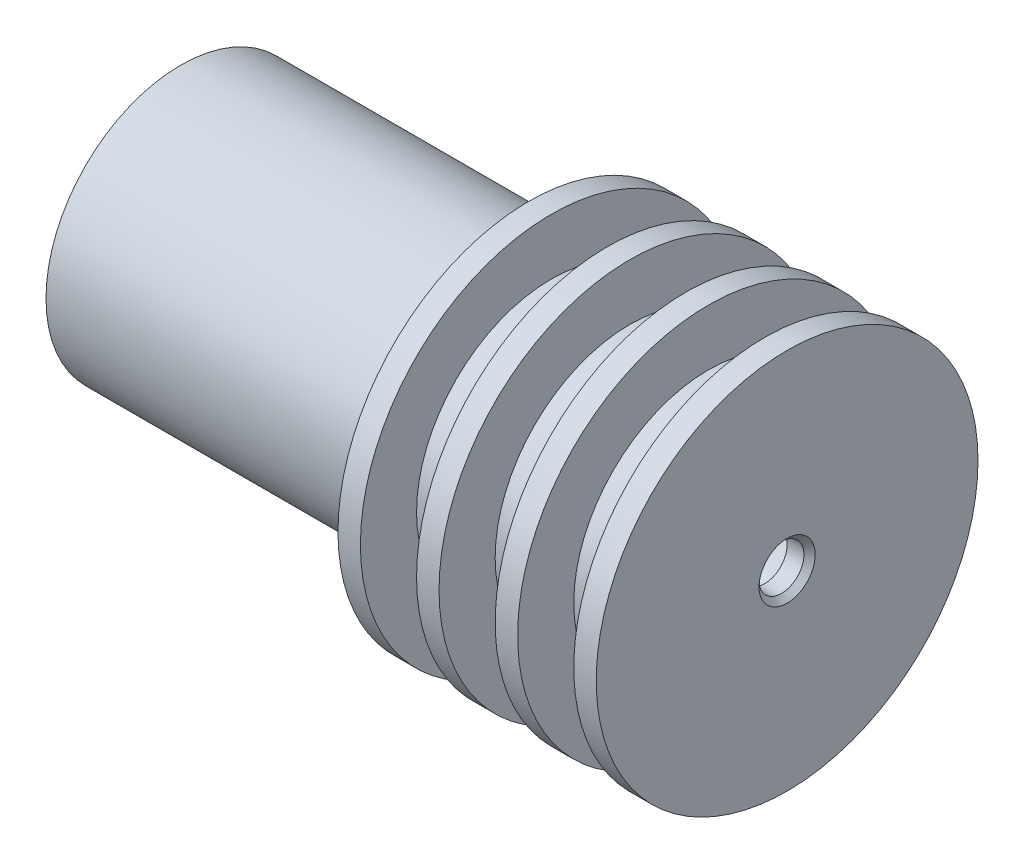
ISO-10303-21;
HEADER;
FILE_DESCRIPTION(('STEP AP214'),'2;1');
FILE_NAME('part.step','',(''),(''),'','','');
FILE_SCHEMA(('AUTOMOTIVE_DESIGN { 1 0 10303 214 1 1 1 1 }'));
ENDSEC;
DATA;
#1=APPLICATION_CONTEXT('core data for automotive mechanical design processes');
#2=APPLICATION_PROTOCOL_DEFINITION('international standard','automotive_design',2000,#1);
#3=PRODUCT_CONTEXT('',#1,'mechanical');
#4=PRODUCT('Part','Part','',(#3));
#5=PRODUCT_RELATED_PRODUCT_CATEGORY('part','',(#4));
#6=PRODUCT_DEFINITION_FORMATION('','',#4);
#7=PRODUCT_DEFINITION_CONTEXT('part definition',#1,'design');
#8=PRODUCT_DEFINITION('design','',#6,#7);
#9=PRODUCT_DEFINITION_SHAPE('','',#8);
#10=(LENGTH_UNIT() NAMED_UNIT(*) SI_UNIT(.MILLI.,.METRE.));
#11=(NAMED_UNIT(*) PLANE_ANGLE_UNIT() SI_UNIT($,.RADIAN.));
#12=(NAMED_UNIT(*) SI_UNIT($,.STERADIAN.) SOLID_ANGLE_UNIT());
#13=UNCERTAINTY_MEASURE_WITH_UNIT(LENGTH_MEASURE(1.E-05),#10,'distance_accuracy_value','');
#14=(GEOMETRIC_REPRESENTATION_CONTEXT(3) GLOBAL_UNCERTAINTY_ASSIGNED_CONTEXT((#13)) GLOBAL_UNIT_ASSIGNED_CONTEXT((#10,
#11,#12)) REPRESENTATION_CONTEXT('',''));
#15=CARTESIAN_POINT('',(0.,0.,0.));
#16=DIRECTION('',(0.,0.,1.));
#17=DIRECTION('',(1.,0.,0.));
#18=AXIS2_PLACEMENT_3D('',#15,#16,#17);
#19=CARTESIAN_POINT('',(28.,0.,0.));
#20=DIRECTION('',(-1.,0.,0.));
#21=DIRECTION('',(0.,0.,1.));
#22=AXIS2_PLACEMENT_3D('',#19,#20,#21);
#23=CYLINDRICAL_SURFACE('',#22,12.);
#24=CARTESIAN_POINT('',(23.,0.,0.));
#25=DIRECTION('',(1.,0.,0.));
#26=DIRECTION('',(0.,0.,-1.));
#27=AXIS2_PLACEMENT_3D('',#24,#25,#26);
#28=CIRCLE('',#27,12.);
#29=CARTESIAN_POINT('',(23.,0.,-12.));
#30=VERTEX_POINT('',#29);
#31=EDGE_CURVE('E72',#30,#30,#28,.T.);
#32=ORIENTED_EDGE('',*,*,#31,.T.);
#33=EDGE_LOOP('',(#32));
#34=FACE_BOUND('',#33,.T.);
#35=CARTESIAN_POINT('',(26.,0.,0.));
#36=DIRECTION('',(1.,0.,0.));
#37=DIRECTION('',(0.,0.,-1.));
#38=AXIS2_PLACEMENT_3D('',#35,#36,#37);
#39=CIRCLE('',#38,12.);
#40=CARTESIAN_POINT('',(26.,0.,-12.));
#41=VERTEX_POINT('',#40);
#42=EDGE_CURVE('E12',#41,#41,#39,.T.);
#43=ORIENTED_EDGE('',*,*,#42,.F.);
#44=EDGE_LOOP('',(#43));
#45=FACE_BOUND('',#44,.T.);
#46=ADVANCED_FACE('F56',(#34,#45),#23,.T.);
#47=CARTESIAN_POINT('',(28.,0.,0.));
#48=DIRECTION('',(1.,0.,0.));
#49=DIRECTION('',(0.,0.,-1.));
#50=AXIS2_PLACEMENT_3D('',#47,#48,#49);
#51=PLANE('',#50);
#52=CARTESIAN_POINT('',(28.,0.,0.));
#53=DIRECTION('',(1.,0.,0.));
#54=DIRECTION('',(0.,0.,-1.));
#55=AXIS2_PLACEMENT_3D('',#52,#53,#54);
#56=CIRCLE('',#55,2.50000000000001);
#57=CARTESIAN_POINT('',(28.,0.,-2.50000000000001));
#58=VERTEX_POINT('',#57);
#59=EDGE_CURVE('E64',#58,#58,#56,.F.);
#60=ORIENTED_EDGE('',*,*,#59,.T.);
#61=EDGE_LOOP('',(#60));
#62=FACE_BOUND('',#61,.T.);
#63=CARTESIAN_POINT('',(28.,0.,0.));
#64=DIRECTION('',(1.,0.,0.));
#65=DIRECTION('',(0.,0.,-1.));
#66=AXIS2_PLACEMENT_3D('',#63,#64,#65);
#67=CIRCLE('',#66,17.);
#68=CARTESIAN_POINT('',(28.,0.,-17.));
#69=VERTEX_POINT('',#68);
#70=EDGE_CURVE('E87',#69,#69,#67,.T.);
#71=ORIENTED_EDGE('',*,*,#70,.T.);
#72=EDGE_LOOP('',(#71));
#73=FACE_BOUND('',#72,.T.);
#74=ADVANCED_FACE('F104',(#62,#73),#51,.T.);
#75=CARTESIAN_POINT('',(23.,0.,0.));
#76=DIRECTION('',(1.,0.,0.));
#77=DIRECTION('',(0.,0.,-1.));
#78=AXIS2_PLACEMENT_3D('',#75,#76,#77);
#79=PLANE('',#78);
#80=CARTESIAN_POINT('',(23.,0.,0.));
#81=DIRECTION('',(1.,0.,0.));
#82=DIRECTION('',(0.,0.,-1.));
#83=AXIS2_PLACEMENT_3D('',#80,#81,#82);
#84=CIRCLE('',#83,10.);
#85=CARTESIAN_POINT('',(23.,0.,10.));
#86=VERTEX_POINT('',#85);
#87=EDGE_CURVE('E80',#86,#86,#84,.T.);
#88=ORIENTED_EDGE('',*,*,#87,.T.);
#89=EDGE_LOOP('',(#88));
#90=FACE_BOUND('',#89,.T.);
#91=ORIENTED_EDGE('',*,*,#31,.F.);
#92=EDGE_LOOP('',(#91));
#93=FACE_BOUND('',#92,.T.);
#94=ADVANCED_FACE('F109',(#90,#93),#79,.F.);
#95=CARTESIAN_POINT('',(26.,0.,0.));
#96=DIRECTION('',(-1.,0.,0.));
#97=DIRECTION('',(0.,0.,1.));
#98=AXIS2_PLACEMENT_3D('',#95,#96,#97);
#99=CYLINDRICAL_SURFACE('',#98,10.);
#100=CARTESIAN_POINT('',(26.,0.,0.));
#101=DIRECTION('',(-1.,0.,0.));
#102=DIRECTION('',(0.,0.,1.));
#103=AXIS2_PLACEMENT_3D('',#100,#101,#102);
#104=CIRCLE('',#103,10.);
#105=CARTESIAN_POINT('',(26.,0.,10.));
#106=VERTEX_POINT('',#105);
#107=EDGE_CURVE('E78',#106,#106,#104,.T.);
#108=CARTESIAN_POINT('',(26.,0.,10.));
#109=CARTESIAN_POINT('',(25.96875,0.,10.));
#110=CARTESIAN_POINT('',(25.9375,0.,10.));
#111=CARTESIAN_POINT('',(25.875,0.,10.));
#112=CARTESIAN_POINT('',(25.84375,0.,10.));
#113=CARTESIAN_POINT('',(25.78125,0.,10.));
#114=CARTESIAN_POINT('',(25.75,0.,10.));
#115=CARTESIAN_POINT('',(25.6875,0.,10.));
#116=CARTESIAN_POINT('',(25.65625,0.,10.));
#117=CARTESIAN_POINT('',(25.59375,0.,10.));
#118=CARTESIAN_POINT('',(25.5625,0.,10.));
#119=CARTESIAN_POINT('',(25.5,0.,10.));
#120=CARTESIAN_POINT('',(25.46875,0.,10.));
#121=CARTESIAN_POINT('',(25.40625,0.,10.));
#122=CARTESIAN_POINT('',(25.375,0.,10.));
#123=CARTESIAN_POINT('',(25.3125,0.,10.));
#124=CARTESIAN_POINT('',(25.28125,0.,10.));
#125=CARTESIAN_POINT('',(25.21875,0.,10.));
#126=CARTESIAN_POINT('',(25.1875,0.,10.));
#127=CARTESIAN_POINT('',(25.125,0.,10.));
#128=CARTESIAN_POINT('',(25.09375,0.,10.));
#129=CARTESIAN_POINT('',(25.03125,0.,10.));
#130=CARTESIAN_POINT('',(25.,0.,10.));
#131=CARTESIAN_POINT('',(24.9375,0.,10.));
#132=CARTESIAN_POINT('',(24.90625,0.,10.));
#133=CARTESIAN_POINT('',(24.84375,0.,10.));
#134=CARTESIAN_POINT('',(24.8125,0.,10.));
#135=CARTESIAN_POINT('',(24.75,0.,10.));
#136=CARTESIAN_POINT('',(24.71875,0.,10.));
#137=CARTESIAN_POINT('',(24.65625,0.,10.));
#138=CARTESIAN_POINT('',(24.625,0.,10.));
#139=CARTESIAN_POINT('',(24.5625,0.,10.));
#140=CARTESIAN_POINT('',(24.53125,0.,10.));
#141=CARTESIAN_POINT('',(24.46875,0.,10.));
#142=CARTESIAN_POINT('',(24.4375,0.,10.));
#143=CARTESIAN_POINT('',(24.375,0.,10.));
#144=CARTESIAN_POINT('',(24.34375,0.,10.));
#145=CARTESIAN_POINT('',(24.28125,0.,10.));
#146=CARTESIAN_POINT('',(24.25,0.,10.));
#147=CARTESIAN_POINT('',(24.1875,0.,10.));
#148=CARTESIAN_POINT('',(24.15625,0.,10.));
#149=CARTESIAN_POINT('',(24.09375,0.,10.));
#150=CARTESIAN_POINT('',(24.0625,0.,10.));
#151=CARTESIAN_POINT('',(24.,0.,10.));
#152=CARTESIAN_POINT('',(23.96875,0.,10.));
#153=CARTESIAN_POINT('',(23.90625,0.,10.));
#154=CARTESIAN_POINT('',(23.875,0.,10.));
#155=CARTESIAN_POINT('',(23.8125,0.,10.));
#156=CARTESIAN_POINT('',(23.78125,0.,10.));
#157=CARTESIAN_POINT('',(23.71875,0.,10.));
#158=CARTESIAN_POINT('',(23.6875,0.,10.));
#159=CARTESIAN_POINT('',(23.625,0.,10.));
#160=CARTESIAN_POINT('',(23.59375,0.,10.));
#161=CARTESIAN_POINT('',(23.53125,0.,10.));
#162=CARTESIAN_POINT('',(23.5,0.,10.));
#163=CARTESIAN_POINT('',(23.4375,0.,10.));
#164=CARTESIAN_POINT('',(23.40625,0.,10.));
#165=CARTESIAN_POINT('',(23.34375,0.,10.));
#166=CARTESIAN_POINT('',(23.3125,0.,10.));
#167=CARTESIAN_POINT('',(23.25,0.,10.));
#168=CARTESIAN_POINT('',(23.21875,0.,10.));
#169=CARTESIAN_POINT('',(23.15625,0.,10.));
#170=CARTESIAN_POINT('',(23.125,0.,10.));
#171=CARTESIAN_POINT('',(23.0625,0.,10.));
#172=CARTESIAN_POINT('',(23.03125,0.,10.));
#173=CARTESIAN_POINT('',(23.,0.,10.));
#174=B_SPLINE_CURVE_WITH_KNOTS('',3,(#108,#109,#110,#111,#112,#113,#114,#115,#116,#117,#118,
#119,#120,#121,#122,#123,#124,#125,#126,#127,#128,#129,#130,#131,#132,#133,#134,#135,#136,#137,
#138,#139,#140,#141,#142,#143,#144,#145,#146,#147,#148,#149,#150,#151,#152,#153,#154,#155,#156,
#157,#158,#159,#160,#161,#162,#163,#164,#165,#166,#167,#168,#169,#170,#171,#172,#173),
.UNSPECIFIED.,.F.,.F.,(4,2,2,2,2,2,2,2,2,2,2,2,2,2,2,2,2,2,2,2,2,2,2,2,2,2,2,2,2,2,2,2,4),(0.,
0.0937500000000001,0.1875,0.28125,0.375,0.46875,0.5625,0.656250000000001,0.750000000000001,
0.843750000000001,0.937500000000001,1.03125,1.125,1.21875,1.3125,1.40625,1.5,1.59375,1.6875,
1.78125,1.875,1.96875,2.0625,2.15625,2.25,2.34375,2.4375,2.53125,2.625,2.71875,2.8125,2.90625,
3.),.UNSPECIFIED.);
#175=EDGE_CURVE('BSEAM114',#106,#86,#174,.T.);
#176=ORIENTED_EDGE('',*,*,#107,.F.);
#177=ORIENTED_EDGE('',*,*,#87,.F.);
#178=ORIENTED_EDGE('',*,*,#175,.T.);
#179=ORIENTED_EDGE('',*,*,#175,.F.);
#180=EDGE_LOOP('',(#176,#178,#177,#179));
#181=FACE_BOUND('',#180,.T.);
#182=ADVANCED_FACE('F114',(#181),#99,.F.);
#183=CARTESIAN_POINT('',(26.,0.,0.));
#184=DIRECTION('',(-1.,0.,0.));
#185=DIRECTION('',(0.,0.,1.));
#186=AXIS2_PLACEMENT_3D('',#183,#184,#185);
#187=PLANE('',#186);
#188=CARTESIAN_POINT('',(26.,0.,0.));
#189=DIRECTION('',(-1.,0.,0.));
#190=DIRECTION('',(0.,0.,1.));
#191=AXIS2_PLACEMENT_3D('',#188,#189,#190);
#192=CIRCLE('',#191,2.);
#193=CARTESIAN_POINT('',(26.,0.,2.));
#194=VERTEX_POINT('',#193);
#195=EDGE_CURVE('E75',#194,#194,#192,.T.);
#196=ORIENTED_EDGE('',*,*,#195,.F.);
#197=EDGE_LOOP('',(#196));
#198=FACE_BOUND('',#197,.T.);
#199=ORIENTED_EDGE('',*,*,#107,.T.);
#200=EDGE_LOOP('',(#199));
#201=FACE_BOUND('',#200,.T.);
#202=ADVANCED_FACE('F119',(#198,#201),#187,.T.);
#203=CARTESIAN_POINT('',(-26.,0.,0.));
#204=DIRECTION('',(1.,0.,0.));
#205=DIRECTION('',(0.,0.,-1.));
#206=AXIS2_PLACEMENT_3D('',#203,#204,#205);
#207=CYLINDRICAL_SURFACE('',#206,2.);
#208=CARTESIAN_POINT('',(27.5,0.,0.));
#209=DIRECTION('',(1.,0.,0.));
#210=DIRECTION('',(0.,0.,-1.));
#211=AXIS2_PLACEMENT_3D('',#208,#209,#210);
#212=CIRCLE('',#211,2.);
#213=CARTESIAN_POINT('',(27.5,0.,-2.));
#214=VERTEX_POINT('',#213);
#215=EDGE_CURVE('E68',#214,#214,#212,.T.);
#216=ORIENTED_EDGE('',*,*,#215,.T.);
#217=EDGE_LOOP('',(#216));
#218=FACE_BOUND('',#217,.T.);
#219=ORIENTED_EDGE('',*,*,#195,.T.);
#220=EDGE_LOOP('',(#219));
#221=FACE_BOUND('',#220,.T.);
#222=ADVANCED_FACE('F123',(#218,#221),#207,.F.);
#223=CARTESIAN_POINT('',(27.5,0.,0.));
#224=DIRECTION('',(1.,0.,0.));
#225=DIRECTION('',(0.,0.,-1.));
#226=AXIS2_PLACEMENT_3D('',#223,#224,#225);
#227=CONICAL_SURFACE('',#226,2.,0.78539816339746);
#228=ORIENTED_EDGE('',*,*,#59,.F.);
#229=EDGE_LOOP('',(#228));
#230=FACE_BOUND('',#229,.T.);
#231=ORIENTED_EDGE('',*,*,#215,.F.);
#232=EDGE_LOOP('',(#231));
#233=FACE_BOUND('',#232,.T.);
#234=ADVANCED_FACE('F59',(#230,#233),#227,.F.);
#235=CARTESIAN_POINT('',(26.,0.,0.));
#236=DIRECTION('',(1.,0.,0.));
#237=DIRECTION('',(0.,0.,-1.));
#238=AXIS2_PLACEMENT_3D('',#235,#236,#237);
#239=CYLINDRICAL_SURFACE('',#238,17.);
#240=CARTESIAN_POINT('',(26.,0.,0.));
#241=DIRECTION('',(1.,0.,0.));
#242=DIRECTION('',(0.,0.,-1.));
#243=AXIS2_PLACEMENT_3D('',#240,#241,#242);
#244=CIRCLE('',#243,17.);
#245=CARTESIAN_POINT('',(26.,0.,-17.));
#246=VERTEX_POINT('',#245);
#247=EDGE_CURVE('E79',#246,#246,#244,.T.);
#248=ORIENTED_EDGE('',*,*,#247,.T.);
#249=EDGE_LOOP('',(#248));
#250=FACE_BOUND('',#249,.T.);
#251=ORIENTED_EDGE('',*,*,#70,.F.);
#252=EDGE_LOOP('',(#251));
#253=FACE_BOUND('',#252,.T.);
#254=ADVANCED_FACE('F93',(#250,#253),#239,.T.);
#255=CARTESIAN_POINT('',(26.,0.,0.));
#256=DIRECTION('',(1.,0.,0.));
#257=DIRECTION('',(0.,0.,-1.));
#258=AXIS2_PLACEMENT_3D('',#255,#256,#257);
#259=PLANE('',#258);
#260=ORIENTED_EDGE('',*,*,#42,.T.);
#261=EDGE_LOOP('',(#260));
#262=FACE_BOUND('',#261,.T.);
#263=ORIENTED_EDGE('',*,*,#247,.F.);
#264=EDGE_LOOP('',(#263));
#265=FACE_BOUND('',#264,.T.);
#266=ADVANCED_FACE('F96',(#262,#265),#259,.F.);
#267=CLOSED_SHELL('',(#46,#74,#94,#182,#202,#222,#234,#254,#266));
#268=MANIFOLD_SOLID_BREP('B2',#267);
#269=CARTESIAN_POINT('',(-26.,0.,0.));
#270=DIRECTION('',(-1.,0.,0.));
#271=DIRECTION('',(0.,0.,1.));
#272=AXIS2_PLACEMENT_3D('',#269,#270,#271);
#273=CYLINDRICAL_SURFACE('',#272,12.);
#274=CARTESIAN_POINT('',(12.,0.,0.));
#275=DIRECTION('',(-1.,0.,0.));
#276=DIRECTION('',(0.,0.,1.));
#277=AXIS2_PLACEMENT_3D('',#274,#275,#276);
#278=CIRCLE('',#277,12.);
#279=CARTESIAN_POINT('',(12.,0.,12.));
#280=VERTEX_POINT('',#279);
#281=EDGE_CURVE('E231',#280,#280,#278,.T.);
#282=ORIENTED_EDGE('',*,*,#281,.T.);
#283=EDGE_LOOP('',(#282));
#284=FACE_BOUND('',#283,.T.);
#285=CARTESIAN_POINT('',(6.99999999999999,0.,0.));
#286=DIRECTION('',(-1.,0.,0.));
#287=DIRECTION('',(0.,0.,1.));
#288=AXIS2_PLACEMENT_3D('',#285,#286,#287);
#289=CIRCLE('',#288,12.);
#290=CARTESIAN_POINT('',(6.99999999999999,0.,12.));
#291=VERTEX_POINT('',#290);
#292=EDGE_CURVE('E55',#291,#291,#289,.T.);
#293=ORIENTED_EDGE('',*,*,#292,.F.);
#294=EDGE_LOOP('',(#293));
#295=FACE_BOUND('',#294,.T.);
#296=ADVANCED_FACE('F211',(#284,#295),#273,.T.);
#297=CARTESIAN_POINT('',(19.,0.,0.));
#298=DIRECTION('',(1.,0.,0.));
#299=DIRECTION('',(0.,0.,-1.));
#300=AXIS2_PLACEMENT_3D('',#297,#298,#299);
#301=CIRCLE('',#300,12.);
#302=CARTESIAN_POINT('',(19.,0.,-12.));
#303=VERTEX_POINT('',#302);
#304=EDGE_CURVE('E223',#303,#303,#301,.T.);
#305=ORIENTED_EDGE('',*,*,#304,.F.);
#306=EDGE_LOOP('',(#305));
#307=FACE_BOUND('',#306,.T.);
#308=CARTESIAN_POINT('',(14.,0.,0.));
#309=DIRECTION('',(-1.,0.,0.));
#310=DIRECTION('',(0.,0.,1.));
#311=AXIS2_PLACEMENT_3D('',#308,#309,#310);
#312=CIRCLE('',#311,12.);
#313=CARTESIAN_POINT('',(14.,0.,12.));
#314=VERTEX_POINT('',#313);
#315=EDGE_CURVE('E215',#314,#314,#312,.T.);
#316=ORIENTED_EDGE('',*,*,#315,.F.);
#317=EDGE_LOOP('',(#316));
#318=FACE_BOUND('',#317,.T.);
#319=ADVANCED_FACE('F267',(#307,#318),#273,.T.);
#320=CARTESIAN_POINT('',(4.99999999999999,0.,0.));
#321=DIRECTION('',(-1.,0.,0.));
#322=DIRECTION('',(0.,0.,1.));
#323=AXIS2_PLACEMENT_3D('',#320,#321,#322);
#324=CIRCLE('',#323,12.);
#325=CARTESIAN_POINT('',(4.99999999999999,0.,12.));
#326=VERTEX_POINT('',#325);
#327=EDGE_CURVE('E228',#326,#326,#324,.T.);
#328=ORIENTED_EDGE('',*,*,#327,.T.);
#329=EDGE_LOOP('',(#328));
#330=FACE_BOUND('',#329,.T.);
#331=CARTESIAN_POINT('',(-26.,0.,0.));
#332=DIRECTION('',(-1.,0.,0.));
#333=DIRECTION('',(0.,0.,1.));
#334=AXIS2_PLACEMENT_3D('',#331,#332,#333);
#335=CIRCLE('',#334,12.);
#336=CARTESIAN_POINT('',(-26.,0.,12.));
#337=VERTEX_POINT('',#336);
#338=EDGE_CURVE('E256',#337,#337,#335,.T.);
#339=ORIENTED_EDGE('',*,*,#338,.F.);
#340=EDGE_LOOP('',(#339));
#341=FACE_BOUND('',#340,.T.);
#342=ADVANCED_FACE('F270',(#330,#341),#273,.T.);
#343=CARTESIAN_POINT('',(21.,0.,0.));
#344=DIRECTION('',(1.,0.,0.));
#345=DIRECTION('',(0.,0.,-1.));
#346=AXIS2_PLACEMENT_3D('',#343,#344,#345);
#347=CIRCLE('',#346,12.);
#348=CARTESIAN_POINT('',(21.,0.,-12.));
#349=VERTEX_POINT('',#348);
#350=EDGE_CURVE('E239',#349,#349,#347,.T.);
#351=ORIENTED_EDGE('',*,*,#350,.T.);
#352=EDGE_LOOP('',(#351));
#353=FACE_BOUND('',#352,.T.);
#354=CARTESIAN_POINT('',(23.,0.,0.));
#355=DIRECTION('',(1.,0.,0.));
#356=DIRECTION('',(0.,0.,-1.));
#357=AXIS2_PLACEMENT_3D('',#354,#355,#356);
#358=CIRCLE('',#357,12.);
#359=CARTESIAN_POINT('',(23.,0.,-12.));
#360=VERTEX_POINT('',#359);
#361=EDGE_CURVE('E253',#360,#360,#358,.T.);
#362=ORIENTED_EDGE('',*,*,#361,.F.);
#363=EDGE_LOOP('',(#362));
#364=FACE_BOUND('',#363,.T.);
#365=ADVANCED_FACE('F213',(#353,#364),#273,.T.);
#366=CARTESIAN_POINT('',(-26.,0.,0.));
#367=DIRECTION('',(-1.,0.,0.));
#368=DIRECTION('',(0.,0.,1.));
#369=AXIS2_PLACEMENT_3D('',#366,#367,#368);
#370=CYLINDRICAL_SURFACE('',#369,10.);
#371=CARTESIAN_POINT('',(-26.,0.,0.));
#372=DIRECTION('',(-1.,0.,0.));
#373=DIRECTION('',(0.,0.,1.));
#374=AXIS2_PLACEMENT_3D('',#371,#372,#373);
#375=CIRCLE('',#374,10.);
#376=CARTESIAN_POINT('',(-26.,0.,10.));
#377=VERTEX_POINT('',#376);
#378=EDGE_CURVE('E259',#377,#377,#375,.T.);
#379=ORIENTED_EDGE('',*,*,#378,.T.);
#380=EDGE_LOOP('',(#379));
#381=FACE_BOUND('',#380,.T.);
#382=CARTESIAN_POINT('',(23.,0.,0.));
#383=DIRECTION('',(1.,0.,0.));
#384=DIRECTION('',(0.,0.,-1.));
#385=AXIS2_PLACEMENT_3D('',#382,#383,#384);
#386=CIRCLE('',#385,10.);
#387=CARTESIAN_POINT('',(23.,0.,-10.));
#388=VERTEX_POINT('',#387);
#389=EDGE_CURVE('E248',#388,#388,#386,.T.);
#390=ORIENTED_EDGE('',*,*,#389,.T.);
#391=EDGE_LOOP('',(#390));
#392=FACE_BOUND('',#391,.T.);
#393=ADVANCED_FACE('F296',(#381,#392),#370,.F.);
#394=CARTESIAN_POINT('',(-26.,10.,0.));
#395=DIRECTION('',(1.,0.,0.));
#396=DIRECTION('',(0.,0.,-1.));
#397=AXIS2_PLACEMENT_3D('',#394,#395,#396);
#398=PLANE('',#397);
#399=ORIENTED_EDGE('',*,*,#378,.F.);
#400=EDGE_LOOP('',(#399));
#401=FACE_BOUND('',#400,.T.);
#402=ORIENTED_EDGE('',*,*,#338,.T.);
#403=EDGE_LOOP('',(#402));
#404=FACE_BOUND('',#403,.T.);
#405=ADVANCED_FACE('F302',(#401,#404),#398,.F.);
#406=CARTESIAN_POINT('',(23.,0.,0.));
#407=DIRECTION('',(1.,0.,0.));
#408=DIRECTION('',(0.,0.,-1.));
#409=AXIS2_PLACEMENT_3D('',#406,#407,#408);
#410=PLANE('',#409);
#411=ORIENTED_EDGE('',*,*,#361,.T.);
#412=EDGE_LOOP('',(#411));
#413=FACE_BOUND('',#412,.T.);
#414=ORIENTED_EDGE('',*,*,#389,.F.);
#415=EDGE_LOOP('',(#414));
#416=FACE_BOUND('',#415,.T.);
#417=ADVANCED_FACE('F309',(#413,#416),#410,.T.);
#418=CARTESIAN_POINT('',(19.,0.,0.));
#419=DIRECTION('',(1.,0.,0.));
#420=DIRECTION('',(0.,0.,-1.));
#421=AXIS2_PLACEMENT_3D('',#418,#419,#420);
#422=CYLINDRICAL_SURFACE('',#421,17.);
#423=CARTESIAN_POINT('',(19.,0.,0.));
#424=DIRECTION('',(1.,0.,0.));
#425=DIRECTION('',(0.,0.,-1.));
#426=AXIS2_PLACEMENT_3D('',#423,#424,#425);
#427=CIRCLE('',#426,17.);
#428=CARTESIAN_POINT('',(19.,0.,-17.));
#429=VERTEX_POINT('',#428);
#430=EDGE_CURVE('E245',#429,#429,#427,.T.);
#431=ORIENTED_EDGE('',*,*,#430,.T.);
#432=EDGE_LOOP('',(#431));
#433=FACE_BOUND('',#432,.T.);
#434=CARTESIAN_POINT('',(21.,0.,0.));
#435=DIRECTION('',(1.,0.,0.));
#436=DIRECTION('',(0.,0.,-1.));
#437=AXIS2_PLACEMENT_3D('',#434,#435,#436);
#438=CIRCLE('',#437,17.);
#439=CARTESIAN_POINT('',(21.,0.,-17.));
#440=VERTEX_POINT('',#439);
#441=EDGE_CURVE('E244',#440,#440,#438,.T.);
#442=ORIENTED_EDGE('',*,*,#441,.F.);
#443=EDGE_LOOP('',(#442));
#444=FACE_BOUND('',#443,.T.);
#445=ADVANCED_FACE('F312',(#433,#444),#422,.T.);
#446=CARTESIAN_POINT('',(19.,0.,0.));
#447=DIRECTION('',(1.,0.,0.));
#448=DIRECTION('',(0.,0.,-1.));
#449=AXIS2_PLACEMENT_3D('',#446,#447,#448);
#450=PLANE('',#449);
#451=ORIENTED_EDGE('',*,*,#304,.T.);
#452=EDGE_LOOP('',(#451));
#453=FACE_BOUND('',#452,.T.);
#454=ORIENTED_EDGE('',*,*,#430,.F.);
#455=EDGE_LOOP('',(#454));
#456=FACE_BOUND('',#455,.T.);
#457=ADVANCED_FACE('F264',(#453,#456),#450,.F.);
#458=CARTESIAN_POINT('',(21.,0.,0.));
#459=DIRECTION('',(1.,0.,0.));
#460=DIRECTION('',(0.,0.,-1.));
#461=AXIS2_PLACEMENT_3D('',#458,#459,#460);
#462=PLANE('',#461);
#463=ORIENTED_EDGE('',*,*,#350,.F.);
#464=EDGE_LOOP('',(#463));
#465=FACE_BOUND('',#464,.T.);
#466=ORIENTED_EDGE('',*,*,#441,.T.);
#467=EDGE_LOOP('',(#466));
#468=FACE_BOUND('',#467,.T.);
#469=ADVANCED_FACE('F286',(#465,#468),#462,.T.);
#470=CARTESIAN_POINT('',(12.,0.,0.));
#471=DIRECTION('',(-1.,0.,0.));
#472=DIRECTION('',(0.,0.,1.));
#473=AXIS2_PLACEMENT_3D('',#470,#471,#472);
#474=PLANE('',#473);
#475=CARTESIAN_POINT('',(12.,0.,0.));
#476=DIRECTION('',(-1.,0.,0.));
#477=DIRECTION('',(0.,0.,1.));
#478=AXIS2_PLACEMENT_3D('',#475,#476,#477);
#479=CIRCLE('',#478,17.);
#480=CARTESIAN_POINT('',(12.,0.,17.));
#481=VERTEX_POINT('',#480);
#482=EDGE_CURVE('E236',#481,#481,#479,.T.);
#483=ORIENTED_EDGE('',*,*,#482,.T.);
#484=EDGE_LOOP('',(#483));
#485=FACE_BOUND('',#484,.T.);
#486=ORIENTED_EDGE('',*,*,#281,.F.);
#487=EDGE_LOOP('',(#486));
#488=FACE_BOUND('',#487,.T.);
#489=ADVANCED_FACE('F276',(#485,#488),#474,.T.);
#490=CARTESIAN_POINT('',(14.,0.,0.));
#491=DIRECTION('',(-1.,0.,0.));
#492=DIRECTION('',(0.,0.,1.));
#493=AXIS2_PLACEMENT_3D('',#490,#491,#492);
#494=PLANE('',#493);
#495=CARTESIAN_POINT('',(14.,0.,0.));
#496=DIRECTION('',(-1.,0.,0.));
#497=DIRECTION('',(0.,0.,1.));
#498=AXIS2_PLACEMENT_3D('',#495,#496,#497);
#499=CIRCLE('',#498,17.);
#500=CARTESIAN_POINT('',(14.,0.,17.));
#501=VERTEX_POINT('',#500);
#502=EDGE_CURVE('E235',#501,#501,#499,.T.);
#503=ORIENTED_EDGE('',*,*,#502,.F.);
#504=EDGE_LOOP('',(#503));
#505=FACE_BOUND('',#504,.T.);
#506=ORIENTED_EDGE('',*,*,#315,.T.);
#507=EDGE_LOOP('',(#506));
#508=FACE_BOUND('',#507,.T.);
#509=ADVANCED_FACE('F273',(#505,#508),#494,.F.);
#510=CARTESIAN_POINT('',(12.,0.,0.));
#511=DIRECTION('',(1.,0.,0.));
#512=DIRECTION('',(0.,0.,-1.));
#513=AXIS2_PLACEMENT_3D('',#510,#511,#512);
#514=CYLINDRICAL_SURFACE('',#513,17.);
#515=ORIENTED_EDGE('',*,*,#482,.F.);
#516=EDGE_LOOP('',(#515));
#517=FACE_BOUND('',#516,.T.);
#518=ORIENTED_EDGE('',*,*,#502,.T.);
#519=EDGE_LOOP('',(#518));
#520=FACE_BOUND('',#519,.T.);
#521=ADVANCED_FACE('F275',(#517,#520),#514,.T.);
#522=CARTESIAN_POINT('',(4.99999999999999,0.,0.));
#523=DIRECTION('',(-1.,0.,0.));
#524=DIRECTION('',(0.,0.,1.));
#525=AXIS2_PLACEMENT_3D('',#522,#523,#524);
#526=PLANE('',#525);
#527=CARTESIAN_POINT('',(4.99999999999999,0.,0.));
#528=DIRECTION('',(-1.,0.,0.));
#529=DIRECTION('',(0.,0.,1.));
#530=AXIS2_PLACEMENT_3D('',#527,#528,#529);
#531=CIRCLE('',#530,17.);
#532=CARTESIAN_POINT('',(4.99999999999999,0.,17.));
#533=VERTEX_POINT('',#532);
#534=EDGE_CURVE('E232',#533,#533,#531,.T.);
#535=ORIENTED_EDGE('',*,*,#534,.T.);
#536=EDGE_LOOP('',(#535));
#537=FACE_BOUND('',#536,.T.);
#538=ORIENTED_EDGE('',*,*,#327,.F.);
#539=EDGE_LOOP('',(#538));
#540=FACE_BOUND('',#539,.T.);
#541=ADVANCED_FACE('F283',(#537,#540),#526,.T.);
#542=CARTESIAN_POINT('',(6.99999999999999,0.,0.));
#543=DIRECTION('',(-1.,0.,0.));
#544=DIRECTION('',(0.,0.,1.));
#545=AXIS2_PLACEMENT_3D('',#542,#543,#544);
#546=PLANE('',#545);
#547=CARTESIAN_POINT('',(6.99999999999999,0.,0.));
#548=DIRECTION('',(-1.,0.,0.));
#549=DIRECTION('',(0.,0.,1.));
#550=AXIS2_PLACEMENT_3D('',#547,#548,#549);
#551=CIRCLE('',#550,17.);
#552=CARTESIAN_POINT('',(6.99999999999999,0.,17.));
#553=VERTEX_POINT('',#552);
#554=EDGE_CURVE('E226',#553,#553,#551,.T.);
#555=ORIENTED_EDGE('',*,*,#554,.F.);
#556=EDGE_LOOP('',(#555));
#557=FACE_BOUND('',#556,.T.);
#558=ORIENTED_EDGE('',*,*,#292,.T.);
#559=EDGE_LOOP('',(#558));
#560=FACE_BOUND('',#559,.T.);
#561=ADVANCED_FACE('F386',(#557,#560),#546,.F.);
#562=CARTESIAN_POINT('',(4.99999999999999,0.,0.));
#563=DIRECTION('',(1.,0.,0.));
#564=DIRECTION('',(0.,0.,-1.));
#565=AXIS2_PLACEMENT_3D('',#562,#563,#564);
#566=CYLINDRICAL_SURFACE('',#565,17.);
#567=ORIENTED_EDGE('',*,*,#534,.F.);
#568=EDGE_LOOP('',(#567));
#569=FACE_BOUND('',#568,.T.);
#570=ORIENTED_EDGE('',*,*,#554,.T.);
#571=EDGE_LOOP('',(#570));
#572=FACE_BOUND('',#571,.T.);
#573=ADVANCED_FACE('F397',(#569,#572),#566,.T.);
#574=CLOSED_SHELL('',(#296,#319,#342,#365,#393,#405,#417,#445,#457,#469,#489,#509,#521,#541,
#561,#573));
#575=MANIFOLD_SOLID_BREP('B7',#574);
#576=ADVANCED_BREP_SHAPE_REPRESENTATION('',(#18,#268,#575),#14);
#577=SHAPE_DEFINITION_REPRESENTATION(#9,#576);
ENDSEC;
END-ISO-10303-21;
